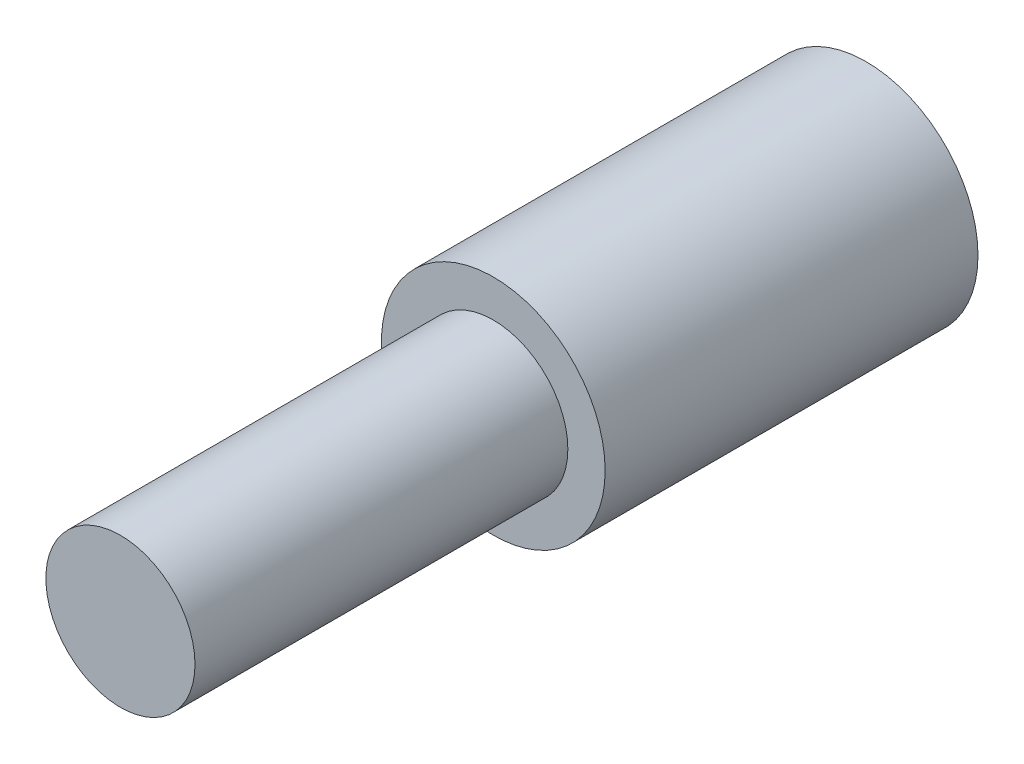
ISO-10303-21;
HEADER;
FILE_DESCRIPTION(('STEP AP214'),'2;1');
FILE_NAME('part.step','',(''),(''),'','','');
FILE_SCHEMA(('AUTOMOTIVE_DESIGN { 1 0 10303 214 1 1 1 1 }'));
ENDSEC;
DATA;
#1=APPLICATION_CONTEXT('core data for automotive mechanical design processes');
#2=APPLICATION_PROTOCOL_DEFINITION('international standard','automotive_design',2000,#1);
#3=PRODUCT_CONTEXT('',#1,'mechanical');
#4=PRODUCT('Part','Part','',(#3));
#5=PRODUCT_RELATED_PRODUCT_CATEGORY('part','',(#4));
#6=PRODUCT_DEFINITION_FORMATION('','',#4);
#7=PRODUCT_DEFINITION_CONTEXT('part definition',#1,'design');
#8=PRODUCT_DEFINITION('design','',#6,#7);
#9=PRODUCT_DEFINITION_SHAPE('','',#8);
#10=(LENGTH_UNIT() NAMED_UNIT(*) SI_UNIT(.MILLI.,.METRE.));
#11=(NAMED_UNIT(*) PLANE_ANGLE_UNIT() SI_UNIT($,.RADIAN.));
#12=(NAMED_UNIT(*) SI_UNIT($,.STERADIAN.) SOLID_ANGLE_UNIT());
#13=UNCERTAINTY_MEASURE_WITH_UNIT(LENGTH_MEASURE(1.E-05),#10,'distance_accuracy_value','');
#14=(GEOMETRIC_REPRESENTATION_CONTEXT(3) GLOBAL_UNCERTAINTY_ASSIGNED_CONTEXT((#13)) GLOBAL_UNIT_ASSIGNED_CONTEXT((#10,
#11,#12)) REPRESENTATION_CONTEXT('',''));
#15=CARTESIAN_POINT('',(0.,0.,0.));
#16=DIRECTION('',(0.,0.,1.));
#17=DIRECTION('',(1.,0.,0.));
#18=AXIS2_PLACEMENT_3D('',#15,#16,#17);
#19=CARTESIAN_POINT('',(0.,0.,10.));
#20=DIRECTION('',(0.,0.,-1.));
#21=DIRECTION('',(-1.,0.,0.));
#22=AXIS2_PLACEMENT_3D('',#19,#20,#21);
#23=CYLINDRICAL_SURFACE('',#22,3.);
#24=CARTESIAN_POINT('',(0.,0.,10.));
#25=DIRECTION('',(0.,0.,1.));
#26=DIRECTION('',(1.,0.,0.));
#27=AXIS2_PLACEMENT_3D('',#24,#25,#26);
#28=CIRCLE('',#27,3.);
#29=CARTESIAN_POINT('',(3.,0.,10.));
#30=VERTEX_POINT('',#29);
#31=EDGE_CURVE('E49',#30,#30,#28,.T.);
#32=ORIENTED_EDGE('',*,*,#31,.F.);
#33=EDGE_LOOP('',(#32));
#34=FACE_BOUND('',#33,.T.);
#35=CARTESIAN_POINT('',(0.,0.,0.));
#36=DIRECTION('',(0.,0.,1.));
#37=DIRECTION('',(1.,0.,0.));
#38=AXIS2_PLACEMENT_3D('',#35,#36,#37);
#39=CIRCLE('',#38,3.);
#40=CARTESIAN_POINT('',(3.,0.,0.));
#41=VERTEX_POINT('',#40);
#42=EDGE_CURVE('E44',#41,#41,#39,.T.);
#43=ORIENTED_EDGE('',*,*,#42,.T.);
#44=EDGE_LOOP('',(#43));
#45=FACE_BOUND('',#44,.T.);
#46=ADVANCED_FACE('F41',(#34,#45),#23,.T.);
#47=CARTESIAN_POINT('',(0.,0.,10.));
#48=DIRECTION('',(0.,0.,1.));
#49=DIRECTION('',(1.,0.,0.));
#50=AXIS2_PLACEMENT_3D('',#47,#48,#49);
#51=PLANE('',#50);
#52=CARTESIAN_POINT('',(0.,0.,10.));
#53=DIRECTION('',(0.,0.,1.));
#54=DIRECTION('',(1.,0.,0.));
#55=AXIS2_PLACEMENT_3D('',#52,#53,#54);
#56=CIRCLE('',#55,2.);
#57=CARTESIAN_POINT('',(2.,0.,10.));
#58=VERTEX_POINT('',#57);
#59=EDGE_CURVE('E10',#58,#58,#56,.T.);
#60=ORIENTED_EDGE('',*,*,#59,.F.);
#61=EDGE_LOOP('',(#60));
#62=FACE_BOUND('',#61,.T.);
#63=ORIENTED_EDGE('',*,*,#31,.T.);
#64=EDGE_LOOP('',(#63));
#65=FACE_BOUND('',#64,.T.);
#66=ADVANCED_FACE('F69',(#62,#65),#51,.T.);
#67=CARTESIAN_POINT('',(0.,0.,0.));
#68=DIRECTION('',(0.,0.,1.));
#69=DIRECTION('',(1.,0.,0.));
#70=AXIS2_PLACEMENT_3D('',#67,#68,#69);
#71=PLANE('',#70);
#72=ORIENTED_EDGE('',*,*,#42,.F.);
#73=EDGE_LOOP('',(#72));
#74=FACE_BOUND('',#73,.T.);
#75=ADVANCED_FACE('F66',(#74),#71,.F.);
#76=CARTESIAN_POINT('',(0.,0.,20.));
#77=DIRECTION('',(0.,0.,-1.));
#78=DIRECTION('',(-1.,0.,0.));
#79=AXIS2_PLACEMENT_3D('',#76,#77,#78);
#80=CYLINDRICAL_SURFACE('',#79,2.);
#81=CARTESIAN_POINT('',(0.,0.,20.));
#82=DIRECTION('',(0.,0.,1.));
#83=DIRECTION('',(1.,0.,0.));
#84=AXIS2_PLACEMENT_3D('',#81,#82,#83);
#85=CIRCLE('',#84,2.);
#86=CARTESIAN_POINT('',(2.,0.,20.));
#87=VERTEX_POINT('',#86);
#88=EDGE_CURVE('E56',#87,#87,#85,.T.);
#89=ORIENTED_EDGE('',*,*,#88,.F.);
#90=EDGE_LOOP('',(#89));
#91=FACE_BOUND('',#90,.T.);
#92=ORIENTED_EDGE('',*,*,#59,.T.);
#93=EDGE_LOOP('',(#92));
#94=FACE_BOUND('',#93,.T.);
#95=ADVANCED_FACE('F68',(#91,#94),#80,.T.);
#96=CARTESIAN_POINT('',(0.,0.,20.));
#97=DIRECTION('',(0.,0.,1.));
#98=DIRECTION('',(1.,0.,0.));
#99=AXIS2_PLACEMENT_3D('',#96,#97,#98);
#100=PLANE('',#99);
#101=ORIENTED_EDGE('',*,*,#88,.T.);
#102=EDGE_LOOP('',(#101));
#103=FACE_BOUND('',#102,.T.);
#104=ADVANCED_FACE('F74',(#103),#100,.T.);
#105=CLOSED_SHELL('',(#46,#66,#75,#95,#104));
#106=MANIFOLD_SOLID_BREP('B2',#105);
#107=ADVANCED_BREP_SHAPE_REPRESENTATION('',(#18,#106),#14);
#108=SHAPE_DEFINITION_REPRESENTATION(#9,#107);
ENDSEC;
END-ISO-10303-21;
